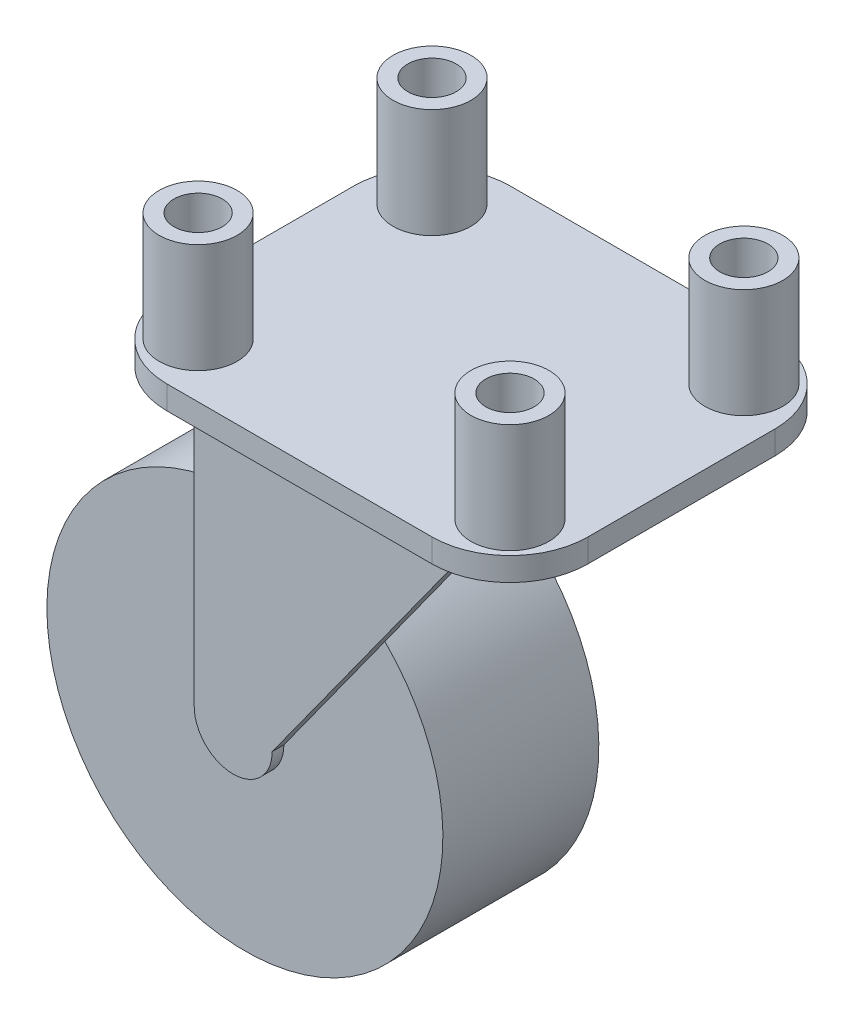
ISO-10303-21;
HEADER;
FILE_DESCRIPTION(('STEP AP214'),'2;1');
FILE_NAME('part.step','',(''),(''),'','','');
FILE_SCHEMA(('AUTOMOTIVE_DESIGN { 1 0 10303 214 1 1 1 1 }'));
ENDSEC;
DATA;
#1=APPLICATION_CONTEXT('core data for automotive mechanical design processes');
#2=APPLICATION_PROTOCOL_DEFINITION('international standard','automotive_design',2000,#1);
#3=PRODUCT_CONTEXT('',#1,'mechanical');
#4=PRODUCT('Part','Part','',(#3));
#5=PRODUCT_RELATED_PRODUCT_CATEGORY('part','',(#4));
#6=PRODUCT_DEFINITION_FORMATION('','',#4);
#7=PRODUCT_DEFINITION_CONTEXT('part definition',#1,'design');
#8=PRODUCT_DEFINITION('design','',#6,#7);
#9=PRODUCT_DEFINITION_SHAPE('','',#8);
#10=(LENGTH_UNIT() NAMED_UNIT(*) SI_UNIT(.MILLI.,.METRE.));
#11=(NAMED_UNIT(*) PLANE_ANGLE_UNIT() SI_UNIT($,.RADIAN.));
#12=(NAMED_UNIT(*) SI_UNIT($,.STERADIAN.) SOLID_ANGLE_UNIT());
#13=UNCERTAINTY_MEASURE_WITH_UNIT(LENGTH_MEASURE(1.E-05),#10,'distance_accuracy_value','');
#14=(GEOMETRIC_REPRESENTATION_CONTEXT(3) GLOBAL_UNCERTAINTY_ASSIGNED_CONTEXT((#13)) GLOBAL_UNIT_ASSIGNED_CONTEXT((#10,
#11,#12)) REPRESENTATION_CONTEXT('',''));
#15=CARTESIAN_POINT('',(0.,0.,0.));
#16=DIRECTION('',(0.,0.,1.));
#17=DIRECTION('',(1.,0.,0.));
#18=AXIS2_PLACEMENT_3D('',#15,#16,#17);
#19=CARTESIAN_POINT('',(0.,44.6,0.));
#20=DIRECTION('',(0.,1.,0.));
#21=DIRECTION('',(0.,0.,1.));
#22=AXIS2_PLACEMENT_3D('',#19,#20,#21);
#23=PLANE('',#22);
#24=CARTESIAN_POINT('',(-1.,44.6,15.));
#25=DIRECTION('',(0.,1.,0.));
#26=DIRECTION('',(0.,0.,1.));
#27=AXIS2_PLACEMENT_3D('',#24,#25,#26);
#28=CIRCLE('',#27,5.);
#29=CARTESIAN_POINT('',(-1.,44.6,20.));
#30=VERTEX_POINT('',#29);
#31=EDGE_CURVE('E700',#30,#30,#28,.T.);
#32=ORIENTED_EDGE('',*,*,#31,.F.);
#33=EDGE_LOOP('',(#32));
#34=FACE_BOUND('',#33,.T.);
#35=CARTESIAN_POINT('',(-1.,44.6,-15.));
#36=DIRECTION('',(0.,1.,0.));
#37=DIRECTION('',(0.,0.,1.));
#38=AXIS2_PLACEMENT_3D('',#35,#36,#37);
#39=CIRCLE('',#38,5.);
#40=CARTESIAN_POINT('',(-1.,44.6,-10.));
#41=VERTEX_POINT('',#40);
#42=EDGE_CURVE('E718',#41,#41,#39,.T.);
#43=ORIENTED_EDGE('',*,*,#42,.F.);
#44=EDGE_LOOP('',(#43));
#45=FACE_BOUND('',#44,.T.);
#46=DIRECTION('',(0.,0.,-1.));
#47=VECTOR('',#46,1.);
#48=CARTESIAN_POINT('',(46.,44.6,-22.));
#49=LINE('',#48,#47);
#50=CARTESIAN_POINT('',(46.,44.6,12.));
#51=VERTEX_POINT('',#50);
#52=CARTESIAN_POINT('',(46.,44.6,-12.));
#53=VERTEX_POINT('',#52);
#54=EDGE_CURVE('E734',#51,#53,#49,.T.);
#55=ORIENTED_EDGE('',*,*,#54,.T.);
#56=CARTESIAN_POINT('',(36.,44.6,-12.));
#57=DIRECTION('',(0.,1.,0.));
#58=DIRECTION('',(0.,0.,1.));
#59=AXIS2_PLACEMENT_3D('',#56,#57,#58);
#60=CIRCLE('',#59,10.);
#61=CARTESIAN_POINT('',(36.,44.6,-22.));
#62=VERTEX_POINT('',#61);
#63=EDGE_CURVE('E265',#53,#62,#60,.T.);
#64=ORIENTED_EDGE('',*,*,#63,.T.);
#65=DIRECTION('',(-1.,0.,0.));
#66=VECTOR('',#65,1.);
#67=CARTESIAN_POINT('',(-8.,44.6,-22.));
#68=LINE('',#67,#66);
#69=CARTESIAN_POINT('',(2.,44.6,-22.));
#70=VERTEX_POINT('',#69);
#71=EDGE_CURVE('E295',#62,#70,#68,.T.);
#72=ORIENTED_EDGE('',*,*,#71,.T.);
#73=CARTESIAN_POINT('',(2.,44.6,-12.));
#74=DIRECTION('',(0.,1.,0.));
#75=DIRECTION('',(0.,0.,1.));
#76=AXIS2_PLACEMENT_3D('',#73,#74,#75);
#77=CIRCLE('',#76,10.);
#78=CARTESIAN_POINT('',(-8.,44.6,-12.));
#79=VERTEX_POINT('',#78);
#80=EDGE_CURVE('E260',#70,#79,#77,.T.);
#81=ORIENTED_EDGE('',*,*,#80,.T.);
#82=DIRECTION('',(0.,0.,1.));
#83=VECTOR('',#82,1.);
#84=CARTESIAN_POINT('',(-8.,44.6,-22.));
#85=LINE('',#84,#83);
#86=CARTESIAN_POINT('',(-8.,44.6,12.));
#87=VERTEX_POINT('',#86);
#88=EDGE_CURVE('E279',#79,#87,#85,.T.);
#89=ORIENTED_EDGE('',*,*,#88,.T.);
#90=CARTESIAN_POINT('',(2.,44.6,12.));
#91=DIRECTION('',(0.,1.,0.));
#92=DIRECTION('',(0.,0.,1.));
#93=AXIS2_PLACEMENT_3D('',#90,#91,#92);
#94=CIRCLE('',#93,10.);
#95=CARTESIAN_POINT('',(2.,44.6,22.));
#96=VERTEX_POINT('',#95);
#97=EDGE_CURVE('E61',#87,#96,#94,.T.);
#98=ORIENTED_EDGE('',*,*,#97,.T.);
#99=DIRECTION('',(1.,0.,0.));
#100=VECTOR('',#99,1.);
#101=CARTESIAN_POINT('',(-8.,44.6,22.));
#102=LINE('',#101,#100);
#103=CARTESIAN_POINT('',(36.,44.6,22.));
#104=VERTEX_POINT('',#103);
#105=EDGE_CURVE('E733',#96,#104,#102,.T.);
#106=ORIENTED_EDGE('',*,*,#105,.T.);
#107=CARTESIAN_POINT('',(36.,44.6,12.));
#108=DIRECTION('',(0.,1.,0.));
#109=DIRECTION('',(0.,0.,1.));
#110=AXIS2_PLACEMENT_3D('',#107,#108,#109);
#111=CIRCLE('',#110,10.);
#112=EDGE_CURVE('E263',#104,#51,#111,.T.);
#113=ORIENTED_EDGE('',*,*,#112,.T.);
#114=EDGE_LOOP('',(#55,#64,#72,#81,#89,#98,#106,#113));
#115=FACE_BOUND('',#114,.T.);
#116=CARTESIAN_POINT('',(39.,44.6,-15.));
#117=DIRECTION('',(0.,1.,0.));
#118=DIRECTION('',(0.,0.,1.));
#119=AXIS2_PLACEMENT_3D('',#116,#117,#118);
#120=CIRCLE('',#119,5.);
#121=CARTESIAN_POINT('',(39.,44.6,-10.));
#122=VERTEX_POINT('',#121);
#123=EDGE_CURVE('E709',#122,#122,#120,.T.);
#124=ORIENTED_EDGE('',*,*,#123,.F.);
#125=EDGE_LOOP('',(#124));
#126=FACE_BOUND('',#125,.T.);
#127=CARTESIAN_POINT('',(39.,44.6,15.));
#128=DIRECTION('',(0.,1.,0.));
#129=DIRECTION('',(0.,0.,1.));
#130=AXIS2_PLACEMENT_3D('',#127,#128,#129);
#131=CIRCLE('',#130,5.);
#132=CARTESIAN_POINT('',(39.,44.6,20.));
#133=VERTEX_POINT('',#132);
#134=EDGE_CURVE('E689',#133,#133,#131,.T.);
#135=ORIENTED_EDGE('',*,*,#134,.F.);
#136=EDGE_LOOP('',(#135));
#137=FACE_BOUND('',#136,.T.);
#138=ADVANCED_FACE('F39',(#34,#45,#115,#126,#137),#23,.T.);
#139=CARTESIAN_POINT('',(0.,0.,-10.));
#140=DIRECTION('',(0.,0.,1.));
#141=DIRECTION('',(1.,0.,0.));
#142=AXIS2_PLACEMENT_3D('',#139,#140,#141);
#143=CYLINDRICAL_SURFACE('',#142,25.4);
#144=CARTESIAN_POINT('',(0.,0.,-10.));
#145=DIRECTION('',(0.,0.,1.));
#146=DIRECTION('',(1.,0.,0.));
#147=AXIS2_PLACEMENT_3D('',#144,#145,#146);
#148=CIRCLE('',#147,25.4);
#149=CARTESIAN_POINT('',(17.9557359837117,17.9652872307469,-10.));
#150=VERTEX_POINT('',#149);
#151=CARTESIAN_POINT('',(-5.,24.9030118660374,-10.));
#152=VERTEX_POINT('',#151);
#153=EDGE_CURVE('E182',#150,#152,#148,.T.);
#154=ORIENTED_EDGE('',*,*,#153,.T.);
#155=EDGE_CURVE('E239',#152,#150,#148,.T.);
#156=ORIENTED_EDGE('',*,*,#155,.T.);
#157=EDGE_LOOP('',(#154,#156));
#158=FACE_BOUND('',#157,.T.);
#159=CARTESIAN_POINT('',(0.,0.,10.));
#160=DIRECTION('',(0.,0.,1.));
#161=DIRECTION('',(1.,0.,0.));
#162=AXIS2_PLACEMENT_3D('',#159,#160,#161);
#163=CIRCLE('',#162,25.4);
#164=CARTESIAN_POINT('',(17.9557359837117,17.9652872307469,10.));
#165=VERTEX_POINT('',#164);
#166=CARTESIAN_POINT('',(-5.,24.9030118660374,10.));
#167=VERTEX_POINT('',#166);
#168=EDGE_CURVE('E236',#165,#167,#163,.T.);
#169=ORIENTED_EDGE('',*,*,#168,.F.);
#170=EDGE_CURVE('E235',#167,#165,#163,.T.);
#171=ORIENTED_EDGE('',*,*,#170,.F.);
#172=EDGE_LOOP('',(#169,#171));
#173=FACE_BOUND('',#172,.T.);
#174=ADVANCED_FACE('F320',(#158,#173),#143,.T.);
#175=CARTESIAN_POINT('',(0.,0.,-10.));
#176=DIRECTION('',(0.,0.,1.));
#177=DIRECTION('',(1.,0.,0.));
#178=AXIS2_PLACEMENT_3D('',#175,#176,#177);
#179=PLANE('',#178);
#180=CARTESIAN_POINT('',(0.,0.,-10.));
#181=DIRECTION('',(0.,0.,1.));
#182=DIRECTION('',(1.,0.,0.));
#183=AXIS2_PLACEMENT_3D('',#180,#181,#182);
#184=CIRCLE('',#183,5.);
#185=CARTESIAN_POINT('',(-5.,0.,-10.));
#186=VERTEX_POINT('',#185);
#187=CARTESIAN_POINT('',(5.,0.,-10.));
#188=VERTEX_POINT('',#187);
#189=EDGE_CURVE('E311',#186,#188,#184,.T.);
#190=ORIENTED_EDGE('',*,*,#189,.T.);
#191=DIRECTION('',(0.584920912340988,0.811090331779504,0.));
#192=VECTOR('',#191,1.);
#193=CARTESIAN_POINT('',(35.,41.6,-10.));
#194=LINE('',#193,#192);
#195=EDGE_CURVE('E186',#188,#150,#194,.T.);
#196=ORIENTED_EDGE('',*,*,#195,.T.);
#197=ORIENTED_EDGE('',*,*,#155,.F.);
#198=DIRECTION('',(0.,-1.,0.));
#199=VECTOR('',#198,1.);
#200=CARTESIAN_POINT('',(-5.,0.,-10.));
#201=LINE('',#200,#199);
#202=EDGE_CURVE('E244',#152,#186,#201,.T.);
#203=ORIENTED_EDGE('',*,*,#202,.T.);
#204=EDGE_LOOP('',(#190,#196,#197,#203));
#205=FACE_BOUND('',#204,.T.);
#206=ADVANCED_FACE('F317',(#205),#179,.F.);
#207=CARTESIAN_POINT('',(0.,0.,10.));
#208=DIRECTION('',(0.,0.,1.));
#209=DIRECTION('',(1.,0.,0.));
#210=AXIS2_PLACEMENT_3D('',#207,#208,#209);
#211=PLANE('',#210);
#212=DIRECTION('',(0.,-1.,0.));
#213=VECTOR('',#212,1.);
#214=CARTESIAN_POINT('',(-5.,0.,10.));
#215=LINE('',#214,#213);
#216=CARTESIAN_POINT('',(-5.,0.,10.));
#217=VERTEX_POINT('',#216);
#218=EDGE_CURVE('E224',#167,#217,#215,.T.);
#219=ORIENTED_EDGE('',*,*,#218,.F.);
#220=ORIENTED_EDGE('',*,*,#170,.T.);
#221=DIRECTION('',(0.584920912340988,0.811090331779504,0.));
#222=VECTOR('',#221,1.);
#223=CARTESIAN_POINT('',(35.,41.6,10.));
#224=LINE('',#223,#222);
#225=CARTESIAN_POINT('',(5.,0.,10.));
#226=VERTEX_POINT('',#225);
#227=EDGE_CURVE('E217',#226,#165,#224,.T.);
#228=ORIENTED_EDGE('',*,*,#227,.F.);
#229=CARTESIAN_POINT('',(0.,0.,10.));
#230=DIRECTION('',(0.,0.,1.));
#231=DIRECTION('',(1.,0.,0.));
#232=AXIS2_PLACEMENT_3D('',#229,#230,#231);
#233=CIRCLE('',#232,5.);
#234=EDGE_CURVE('E200',#217,#226,#233,.T.);
#235=ORIENTED_EDGE('',*,*,#234,.F.);
#236=EDGE_LOOP('',(#219,#220,#228,#235));
#237=FACE_BOUND('',#236,.T.);
#238=ADVANCED_FACE('F330',(#237),#211,.T.);
#239=CARTESIAN_POINT('',(0.,0.,10.));
#240=DIRECTION('',(0.,0.,1.));
#241=DIRECTION('',(1.,0.,0.));
#242=AXIS2_PLACEMENT_3D('',#239,#240,#241);
#243=PLANE('',#242);
#244=CARTESIAN_POINT('',(35.,41.6,10.));
#245=VERTEX_POINT('',#244);
#246=EDGE_CURVE('E216',#165,#245,#224,.T.);
#247=ORIENTED_EDGE('',*,*,#246,.F.);
#248=ORIENTED_EDGE('',*,*,#168,.T.);
#249=CARTESIAN_POINT('',(-5.,41.6,10.));
#250=VERTEX_POINT('',#249);
#251=EDGE_CURVE('E205',#250,#167,#215,.T.);
#252=ORIENTED_EDGE('',*,*,#251,.F.);
#253=DIRECTION('',(-1.,0.,0.));
#254=VECTOR('',#253,1.);
#255=CARTESIAN_POINT('',(-5.,41.6,10.));
#256=LINE('',#255,#254);
#257=EDGE_CURVE('E220',#245,#250,#256,.T.);
#258=ORIENTED_EDGE('',*,*,#257,.F.);
#259=EDGE_LOOP('',(#247,#248,#252,#258));
#260=FACE_BOUND('',#259,.T.);
#261=ADVANCED_FACE('F334',(#260),#243,.F.);
#262=CARTESIAN_POINT('',(0.,0.,11.5));
#263=DIRECTION('',(0.,0.,-1.));
#264=DIRECTION('',(-1.,0.,0.));
#265=AXIS2_PLACEMENT_3D('',#262,#263,#264);
#266=CYLINDRICAL_SURFACE('',#265,5.);
#267=ORIENTED_EDGE('',*,*,#234,.T.);
#268=DIRECTION('',(0.,0.,-1.));
#269=VECTOR('',#268,1.);
#270=CARTESIAN_POINT('',(5.,0.,11.5));
#271=LINE('',#270,#269);
#272=CARTESIAN_POINT('',(5.,0.,11.5));
#273=VERTEX_POINT('',#272);
#274=EDGE_CURVE('E232',#273,#226,#271,.T.);
#275=ORIENTED_EDGE('',*,*,#274,.F.);
#276=CARTESIAN_POINT('',(0.,0.,11.5));
#277=DIRECTION('',(0.,0.,1.));
#278=DIRECTION('',(1.,0.,0.));
#279=AXIS2_PLACEMENT_3D('',#276,#277,#278);
#280=CIRCLE('',#279,5.);
#281=CARTESIAN_POINT('',(-5.,0.,11.5));
#282=VERTEX_POINT('',#281);
#283=EDGE_CURVE('E201',#282,#273,#280,.T.);
#284=ORIENTED_EDGE('',*,*,#283,.F.);
#285=DIRECTION('',(0.,0.,-1.));
#286=VECTOR('',#285,1.);
#287=CARTESIAN_POINT('',(-5.,0.,11.5));
#288=LINE('',#287,#286);
#289=EDGE_CURVE('E213',#282,#217,#288,.T.);
#290=ORIENTED_EDGE('',*,*,#289,.T.);
#291=EDGE_LOOP('',(#267,#275,#284,#290));
#292=FACE_BOUND('',#291,.T.);
#293=ADVANCED_FACE('F341',(#292),#266,.T.);
#294=CARTESIAN_POINT('',(35.,41.6,11.5));
#295=DIRECTION('',(-0.811090331779504,0.584920912340988,0.));
#296=DIRECTION('',(-0.584920912340988,-0.811090331779504,0.));
#297=AXIS2_PLACEMENT_3D('',#294,#295,#296);
#298=PLANE('',#297);
#299=ORIENTED_EDGE('',*,*,#227,.T.);
#300=ORIENTED_EDGE('',*,*,#246,.T.);
#301=DIRECTION('',(0.,0.,-1.));
#302=VECTOR('',#301,1.);
#303=CARTESIAN_POINT('',(35.,41.6,11.5));
#304=LINE('',#303,#302);
#305=CARTESIAN_POINT('',(35.,41.6,11.5));
#306=VERTEX_POINT('',#305);
#307=EDGE_CURVE('E230',#306,#245,#304,.T.);
#308=ORIENTED_EDGE('',*,*,#307,.F.);
#309=DIRECTION('',(0.584920912340988,0.811090331779504,0.));
#310=VECTOR('',#309,1.);
#311=CARTESIAN_POINT('',(35.,41.6,11.5));
#312=LINE('',#311,#310);
#313=EDGE_CURVE('E204',#273,#306,#312,.T.);
#314=ORIENTED_EDGE('',*,*,#313,.F.);
#315=ORIENTED_EDGE('',*,*,#274,.T.);
#316=EDGE_LOOP('',(#299,#300,#308,#314,#315));
#317=FACE_BOUND('',#316,.T.);
#318=ADVANCED_FACE('F337',(#317),#298,.F.);
#319=CARTESIAN_POINT('',(-5.,0.,11.5));
#320=DIRECTION('',(1.,0.,0.));
#321=DIRECTION('',(0.,0.,-1.));
#322=AXIS2_PLACEMENT_3D('',#319,#320,#321);
#323=PLANE('',#322);
#324=ORIENTED_EDGE('',*,*,#251,.T.);
#325=ORIENTED_EDGE('',*,*,#218,.T.);
#326=ORIENTED_EDGE('',*,*,#289,.F.);
#327=DIRECTION('',(0.,-1.,0.));
#328=VECTOR('',#327,1.);
#329=CARTESIAN_POINT('',(-5.,0.,11.5));
#330=LINE('',#329,#328);
#331=CARTESIAN_POINT('',(-5.,41.6,11.5));
#332=VERTEX_POINT('',#331);
#333=EDGE_CURVE('E211',#332,#282,#330,.T.);
#334=ORIENTED_EDGE('',*,*,#333,.F.);
#335=DIRECTION('',(0.,0.,-1.));
#336=VECTOR('',#335,1.);
#337=CARTESIAN_POINT('',(-5.,41.6,11.5));
#338=LINE('',#337,#336);
#339=EDGE_CURVE('E227',#332,#250,#338,.T.);
#340=ORIENTED_EDGE('',*,*,#339,.T.);
#341=EDGE_LOOP('',(#324,#325,#326,#334,#340));
#342=FACE_BOUND('',#341,.T.);
#343=ADVANCED_FACE('F344',(#342),#323,.F.);
#344=CARTESIAN_POINT('',(0.,0.,11.5));
#345=DIRECTION('',(0.,0.,1.));
#346=DIRECTION('',(1.,0.,0.));
#347=AXIS2_PLACEMENT_3D('',#344,#345,#346);
#348=PLANE('',#347);
#349=ORIENTED_EDGE('',*,*,#283,.T.);
#350=ORIENTED_EDGE('',*,*,#313,.T.);
#351=DIRECTION('',(-1.,0.,0.));
#352=VECTOR('',#351,1.);
#353=CARTESIAN_POINT('',(-5.,41.6,11.5));
#354=LINE('',#353,#352);
#355=EDGE_CURVE('E208',#306,#332,#354,.T.);
#356=ORIENTED_EDGE('',*,*,#355,.T.);
#357=ORIENTED_EDGE('',*,*,#333,.T.);
#358=EDGE_LOOP('',(#349,#350,#356,#357));
#359=FACE_BOUND('',#358,.T.);
#360=ADVANCED_FACE('F615',(#359),#348,.T.);
#361=CARTESIAN_POINT('',(0.,0.,-11.5));
#362=DIRECTION('',(0.,0.,1.));
#363=DIRECTION('',(1.,0.,0.));
#364=AXIS2_PLACEMENT_3D('',#361,#362,#363);
#365=CYLINDRICAL_SURFACE('',#364,5.);
#366=ORIENTED_EDGE('',*,*,#189,.F.);
#367=DIRECTION('',(0.,0.,1.));
#368=VECTOR('',#367,1.);
#369=CARTESIAN_POINT('',(-5.,0.,-11.5));
#370=LINE('',#369,#368);
#371=CARTESIAN_POINT('',(-5.,0.,-11.5));
#372=VERTEX_POINT('',#371);
#373=EDGE_CURVE('E194',#372,#186,#370,.T.);
#374=ORIENTED_EDGE('',*,*,#373,.F.);
#375=CARTESIAN_POINT('',(0.,0.,-11.5));
#376=DIRECTION('',(0.,0.,1.));
#377=DIRECTION('',(1.,0.,0.));
#378=AXIS2_PLACEMENT_3D('',#375,#376,#377);
#379=CIRCLE('',#378,5.);
#380=CARTESIAN_POINT('',(5.,0.,-11.5));
#381=VERTEX_POINT('',#380);
#382=EDGE_CURVE('E302',#372,#381,#379,.T.);
#383=ORIENTED_EDGE('',*,*,#382,.T.);
#384=DIRECTION('',(0.,0.,1.));
#385=VECTOR('',#384,1.);
#386=CARTESIAN_POINT('',(5.,0.,-11.5));
#387=LINE('',#386,#385);
#388=EDGE_CURVE('E192',#381,#188,#387,.T.);
#389=ORIENTED_EDGE('',*,*,#388,.T.);
#390=EDGE_LOOP('',(#366,#374,#383,#389));
#391=FACE_BOUND('',#390,.T.);
#392=ADVANCED_FACE('F351',(#391),#365,.T.);
#393=CARTESIAN_POINT('',(-5.,0.,-11.5));
#394=DIRECTION('',(-1.,0.,0.));
#395=DIRECTION('',(0.,0.,1.));
#396=AXIS2_PLACEMENT_3D('',#393,#394,#395);
#397=PLANE('',#396);
#398=CARTESIAN_POINT('',(-5.,41.6,-10.));
#399=VERTEX_POINT('',#398);
#400=EDGE_CURVE('E177',#399,#152,#201,.T.);
#401=ORIENTED_EDGE('',*,*,#400,.F.);
#402=DIRECTION('',(0.,0.,1.));
#403=VECTOR('',#402,1.);
#404=CARTESIAN_POINT('',(-5.,41.6,-11.5));
#405=LINE('',#404,#403);
#406=CARTESIAN_POINT('',(-5.,41.6,-11.5));
#407=VERTEX_POINT('',#406);
#408=EDGE_CURVE('E172',#407,#399,#405,.T.);
#409=ORIENTED_EDGE('',*,*,#408,.F.);
#410=DIRECTION('',(0.,-1.,0.));
#411=VECTOR('',#410,1.);
#412=CARTESIAN_POINT('',(-5.,0.,-11.5));
#413=LINE('',#412,#411);
#414=EDGE_CURVE('E305',#407,#372,#413,.T.);
#415=ORIENTED_EDGE('',*,*,#414,.T.);
#416=ORIENTED_EDGE('',*,*,#373,.T.);
#417=ORIENTED_EDGE('',*,*,#202,.F.);
#418=EDGE_LOOP('',(#401,#409,#415,#416,#417));
#419=FACE_BOUND('',#418,.T.);
#420=ADVANCED_FACE('F347',(#419),#397,.T.);
#421=CARTESIAN_POINT('',(35.,41.6,-11.5));
#422=DIRECTION('',(0.811090331779504,-0.584920912340988,0.));
#423=DIRECTION('',(0.584920912340988,0.811090331779504,0.));
#424=AXIS2_PLACEMENT_3D('',#421,#422,#423);
#425=PLANE('',#424);
#426=ORIENTED_EDGE('',*,*,#195,.F.);
#427=ORIENTED_EDGE('',*,*,#388,.F.);
#428=DIRECTION('',(0.584920912340988,0.811090331779504,0.));
#429=VECTOR('',#428,1.);
#430=CARTESIAN_POINT('',(35.,41.6,-11.5));
#431=LINE('',#430,#429);
#432=CARTESIAN_POINT('',(35.,41.6,-11.5));
#433=VERTEX_POINT('',#432);
#434=EDGE_CURVE('E191',#381,#433,#431,.T.);
#435=ORIENTED_EDGE('',*,*,#434,.T.);
#436=DIRECTION('',(0.,0.,1.));
#437=VECTOR('',#436,1.);
#438=CARTESIAN_POINT('',(35.,41.6,-11.5));
#439=LINE('',#438,#437);
#440=CARTESIAN_POINT('',(35.,41.6,-10.));
#441=VERTEX_POINT('',#440);
#442=EDGE_CURVE('E169',#433,#441,#439,.T.);
#443=ORIENTED_EDGE('',*,*,#442,.T.);
#444=EDGE_CURVE('E176',#150,#441,#194,.T.);
#445=ORIENTED_EDGE('',*,*,#444,.F.);
#446=EDGE_LOOP('',(#426,#427,#435,#443,#445));
#447=FACE_BOUND('',#446,.T.);
#448=ADVANCED_FACE('F189',(#447),#425,.T.);
#449=CARTESIAN_POINT('',(0.,0.,-11.5));
#450=DIRECTION('',(0.,0.,-1.));
#451=DIRECTION('',(1.,0.,0.));
#452=AXIS2_PLACEMENT_3D('',#449,#450,#451);
#453=PLANE('',#452);
#454=ORIENTED_EDGE('',*,*,#382,.F.);
#455=ORIENTED_EDGE('',*,*,#414,.F.);
#456=DIRECTION('',(-1.,0.,0.));
#457=VECTOR('',#456,1.);
#458=CARTESIAN_POINT('',(-5.,41.6,-11.5));
#459=LINE('',#458,#457);
#460=EDGE_CURVE('E308',#433,#407,#459,.T.);
#461=ORIENTED_EDGE('',*,*,#460,.F.);
#462=ORIENTED_EDGE('',*,*,#434,.F.);
#463=EDGE_LOOP('',(#454,#455,#461,#462));
#464=FACE_BOUND('',#463,.T.);
#465=ADVANCED_FACE('F353',(#464),#453,.T.);
#466=CARTESIAN_POINT('',(0.,0.,-10.));
#467=DIRECTION('',(0.,0.,-1.));
#468=DIRECTION('',(1.,0.,0.));
#469=AXIS2_PLACEMENT_3D('',#466,#467,#468);
#470=PLANE('',#469);
#471=ORIENTED_EDGE('',*,*,#153,.F.);
#472=ORIENTED_EDGE('',*,*,#444,.T.);
#473=DIRECTION('',(-1.,0.,0.));
#474=VECTOR('',#473,1.);
#475=CARTESIAN_POINT('',(-5.,41.6,-10.));
#476=LINE('',#475,#474);
#477=EDGE_CURVE('E164',#441,#399,#476,.T.);
#478=ORIENTED_EDGE('',*,*,#477,.T.);
#479=ORIENTED_EDGE('',*,*,#400,.T.);
#480=EDGE_LOOP('',(#471,#472,#478,#479));
#481=FACE_BOUND('',#480,.T.);
#482=ADVANCED_FACE('F180',(#481),#470,.F.);
#483=CARTESIAN_POINT('',(0.,41.6,0.));
#484=DIRECTION('',(0.,1.,0.));
#485=DIRECTION('',(0.,0.,1.));
#486=AXIS2_PLACEMENT_3D('',#483,#484,#485);
#487=PLANE('',#486);
#488=CARTESIAN_POINT('',(-1.,41.6,15.));
#489=DIRECTION('',(0.,1.,0.));
#490=DIRECTION('',(0.,0.,1.));
#491=AXIS2_PLACEMENT_3D('',#488,#489,#490);
#492=CIRCLE('',#491,3.1);
#493=CARTESIAN_POINT('',(-1.,41.6,18.1));
#494=VERTEX_POINT('',#493);
#495=EDGE_CURVE('E722',#494,#494,#492,.F.);
#496=ORIENTED_EDGE('',*,*,#495,.F.);
#497=EDGE_LOOP('',(#496));
#498=FACE_BOUND('',#497,.T.);
#499=CARTESIAN_POINT('',(39.,41.6,15.));
#500=DIRECTION('',(0.,1.,0.));
#501=DIRECTION('',(0.,0.,1.));
#502=AXIS2_PLACEMENT_3D('',#499,#500,#501);
#503=CIRCLE('',#502,3.09999999999999);
#504=CARTESIAN_POINT('',(39.,41.6,18.1));
#505=VERTEX_POINT('',#504);
#506=EDGE_CURVE('E727',#505,#505,#503,.F.);
#507=ORIENTED_EDGE('',*,*,#506,.F.);
#508=EDGE_LOOP('',(#507));
#509=FACE_BOUND('',#508,.T.);
#510=CARTESIAN_POINT('',(39.,41.6,-15.));
#511=DIRECTION('',(0.,1.,0.));
#512=DIRECTION('',(0.,0.,1.));
#513=AXIS2_PLACEMENT_3D('',#510,#511,#512);
#514=CIRCLE('',#513,3.09999999999999);
#515=CARTESIAN_POINT('',(39.,41.6,-11.9));
#516=VERTEX_POINT('',#515);
#517=EDGE_CURVE('E292',#516,#516,#514,.F.);
#518=ORIENTED_EDGE('',*,*,#517,.F.);
#519=EDGE_LOOP('',(#518));
#520=FACE_BOUND('',#519,.T.);
#521=CARTESIAN_POINT('',(-1.,41.6,-15.));
#522=DIRECTION('',(0.,1.,0.));
#523=DIRECTION('',(0.,0.,1.));
#524=AXIS2_PLACEMENT_3D('',#521,#522,#523);
#525=CIRCLE('',#524,3.1);
#526=CARTESIAN_POINT('',(-1.,41.6,-11.9));
#527=VERTEX_POINT('',#526);
#528=EDGE_CURVE('E287',#527,#527,#525,.F.);
#529=ORIENTED_EDGE('',*,*,#528,.F.);
#530=EDGE_LOOP('',(#529));
#531=FACE_BOUND('',#530,.T.);
#532=ORIENTED_EDGE('',*,*,#460,.T.);
#533=ORIENTED_EDGE('',*,*,#408,.T.);
#534=ORIENTED_EDGE('',*,*,#477,.F.);
#535=ORIENTED_EDGE('',*,*,#442,.F.);
#536=EDGE_LOOP('',(#532,#533,#534,#535));
#537=FACE_BOUND('',#536,.T.);
#538=DIRECTION('',(-1.,0.,0.));
#539=VECTOR('',#538,1.);
#540=CARTESIAN_POINT('',(-8.,41.6,-22.));
#541=LINE('',#540,#539);
#542=CARTESIAN_POINT('',(36.,41.6,-22.));
#543=VERTEX_POINT('',#542);
#544=CARTESIAN_POINT('',(2.,41.6,-22.));
#545=VERTEX_POINT('',#544);
#546=EDGE_CURVE('E300',#543,#545,#541,.T.);
#547=ORIENTED_EDGE('',*,*,#546,.F.);
#548=CARTESIAN_POINT('',(36.,41.6,-12.));
#549=DIRECTION('',(0.,1.,0.));
#550=DIRECTION('',(0.,0.,1.));
#551=AXIS2_PLACEMENT_3D('',#548,#549,#550);
#552=CIRCLE('',#551,10.);
#553=CARTESIAN_POINT('',(46.,41.6,-12.));
#554=VERTEX_POINT('',#553);
#555=EDGE_CURVE('E253',#543,#554,#552,.F.);
#556=ORIENTED_EDGE('',*,*,#555,.T.);
#557=DIRECTION('',(0.,0.,-1.));
#558=VECTOR('',#557,1.);
#559=CARTESIAN_POINT('',(46.,41.6,-22.));
#560=LINE('',#559,#558);
#561=CARTESIAN_POINT('',(46.,41.6,12.));
#562=VERTEX_POINT('',#561);
#563=EDGE_CURVE('E289',#562,#554,#560,.T.);
#564=ORIENTED_EDGE('',*,*,#563,.F.);
#565=CARTESIAN_POINT('',(36.,41.6,12.));
#566=DIRECTION('',(0.,1.,0.));
#567=DIRECTION('',(0.,0.,1.));
#568=AXIS2_PLACEMENT_3D('',#565,#566,#567);
#569=CIRCLE('',#568,10.);
#570=CARTESIAN_POINT('',(36.,41.6,22.));
#571=VERTEX_POINT('',#570);
#572=EDGE_CURVE('E251',#562,#571,#569,.F.);
#573=ORIENTED_EDGE('',*,*,#572,.T.);
#574=DIRECTION('',(1.,0.,0.));
#575=VECTOR('',#574,1.);
#576=CARTESIAN_POINT('',(-8.,41.6,22.));
#577=LINE('',#576,#575);
#578=CARTESIAN_POINT('',(2.,41.6,22.));
#579=VERTEX_POINT('',#578);
#580=EDGE_CURVE('E286',#579,#571,#577,.T.);
#581=ORIENTED_EDGE('',*,*,#580,.F.);
#582=CARTESIAN_POINT('',(2.,41.6,12.));
#583=DIRECTION('',(0.,1.,0.));
#584=DIRECTION('',(0.,0.,1.));
#585=AXIS2_PLACEMENT_3D('',#582,#583,#584);
#586=CIRCLE('',#585,10.);
#587=CARTESIAN_POINT('',(-8.,41.6,12.));
#588=VERTEX_POINT('',#587);
#589=EDGE_CURVE('E249',#579,#588,#586,.F.);
#590=ORIENTED_EDGE('',*,*,#589,.T.);
#591=DIRECTION('',(0.,0.,1.));
#592=VECTOR('',#591,1.);
#593=CARTESIAN_POINT('',(-8.,41.6,-22.));
#594=LINE('',#593,#592);
#595=CARTESIAN_POINT('',(-8.,41.6,-12.));
#596=VERTEX_POINT('',#595);
#597=EDGE_CURVE('E277',#596,#588,#594,.T.);
#598=ORIENTED_EDGE('',*,*,#597,.F.);
#599=CARTESIAN_POINT('',(2.,41.6,-12.));
#600=DIRECTION('',(0.,1.,0.));
#601=DIRECTION('',(0.,0.,1.));
#602=AXIS2_PLACEMENT_3D('',#599,#600,#601);
#603=CIRCLE('',#602,10.);
#604=EDGE_CURVE('E247',#596,#545,#603,.F.);
#605=ORIENTED_EDGE('',*,*,#604,.T.);
#606=EDGE_LOOP('',(#547,#556,#564,#573,#581,#590,#598,#605));
#607=FACE_BOUND('',#606,.T.);
#608=ORIENTED_EDGE('',*,*,#307,.T.);
#609=ORIENTED_EDGE('',*,*,#257,.T.);
#610=ORIENTED_EDGE('',*,*,#339,.F.);
#611=ORIENTED_EDGE('',*,*,#355,.F.);
#612=EDGE_LOOP('',(#608,#609,#610,#611));
#613=FACE_BOUND('',#612,.T.);
#614=ADVANCED_FACE('F166',(#498,#509,#520,#531,#537,#607,#613),#487,.F.);
#615=CARTESIAN_POINT('',(-8.,44.6,-22.));
#616=DIRECTION('',(1.,0.,0.));
#617=DIRECTION('',(0.,0.,-1.));
#618=AXIS2_PLACEMENT_3D('',#615,#616,#617);
#619=PLANE('',#618);
#620=ORIENTED_EDGE('',*,*,#597,.T.);
#621=DIRECTION('',(0.,-1.,0.));
#622=VECTOR('',#621,1.);
#623=CARTESIAN_POINT('',(-8.,44.6,12.));
#624=LINE('',#623,#622);
#625=EDGE_CURVE('E11',#588,#87,#624,.F.);
#626=ORIENTED_EDGE('',*,*,#625,.T.);
#627=ORIENTED_EDGE('',*,*,#88,.F.);
#628=DIRECTION('',(0.,-1.,0.));
#629=VECTOR('',#628,1.);
#630=CARTESIAN_POINT('',(-8.,44.6,-12.));
#631=LINE('',#630,#629);
#632=EDGE_CURVE('E47',#79,#596,#631,.T.);
#633=ORIENTED_EDGE('',*,*,#632,.T.);
#634=EDGE_LOOP('',(#620,#626,#627,#633));
#635=FACE_BOUND('',#634,.T.);
#636=ADVANCED_FACE('F276',(#635),#619,.F.);
#637=CARTESIAN_POINT('',(-8.,44.6,22.));
#638=DIRECTION('',(0.,0.,-1.));
#639=DIRECTION('',(-1.,0.,0.));
#640=AXIS2_PLACEMENT_3D('',#637,#638,#639);
#641=PLANE('',#640);
#642=ORIENTED_EDGE('',*,*,#580,.T.);
#643=DIRECTION('',(0.,-1.,0.));
#644=VECTOR('',#643,1.);
#645=CARTESIAN_POINT('',(36.,44.6,22.));
#646=LINE('',#645,#644);
#647=EDGE_CURVE('E54',#571,#104,#646,.F.);
#648=ORIENTED_EDGE('',*,*,#647,.T.);
#649=ORIENTED_EDGE('',*,*,#105,.F.);
#650=DIRECTION('',(0.,-1.,0.));
#651=VECTOR('',#650,1.);
#652=CARTESIAN_POINT('',(2.,44.6,22.));
#653=LINE('',#652,#651);
#654=EDGE_CURVE('E267',#96,#579,#653,.T.);
#655=ORIENTED_EDGE('',*,*,#654,.T.);
#656=EDGE_LOOP('',(#642,#648,#649,#655));
#657=FACE_BOUND('',#656,.T.);
#658=ADVANCED_FACE('F384',(#657),#641,.F.);
#659=CARTESIAN_POINT('',(46.,44.6,-22.));
#660=DIRECTION('',(-1.,0.,0.));
#661=DIRECTION('',(0.,0.,1.));
#662=AXIS2_PLACEMENT_3D('',#659,#660,#661);
#663=PLANE('',#662);
#664=ORIENTED_EDGE('',*,*,#563,.T.);
#665=DIRECTION('',(0.,-1.,0.));
#666=VECTOR('',#665,1.);
#667=CARTESIAN_POINT('',(46.,44.6,-12.));
#668=LINE('',#667,#666);
#669=EDGE_CURVE('E258',#554,#53,#668,.F.);
#670=ORIENTED_EDGE('',*,*,#669,.T.);
#671=ORIENTED_EDGE('',*,*,#54,.F.);
#672=DIRECTION('',(0.,-1.,0.));
#673=VECTOR('',#672,1.);
#674=CARTESIAN_POINT('',(46.,44.6,12.));
#675=LINE('',#674,#673);
#676=EDGE_CURVE('E255',#51,#562,#675,.T.);
#677=ORIENTED_EDGE('',*,*,#676,.T.);
#678=EDGE_LOOP('',(#664,#670,#671,#677));
#679=FACE_BOUND('',#678,.T.);
#680=ADVANCED_FACE('F380',(#679),#663,.F.);
#681=CARTESIAN_POINT('',(-8.,44.6,-22.));
#682=DIRECTION('',(0.,0.,1.));
#683=DIRECTION('',(1.,0.,0.));
#684=AXIS2_PLACEMENT_3D('',#681,#682,#683);
#685=PLANE('',#684);
#686=ORIENTED_EDGE('',*,*,#71,.F.);
#687=DIRECTION('',(0.,-1.,0.));
#688=VECTOR('',#687,1.);
#689=CARTESIAN_POINT('',(36.,44.6,-22.));
#690=LINE('',#689,#688);
#691=EDGE_CURVE('E243',#62,#543,#690,.T.);
#692=ORIENTED_EDGE('',*,*,#691,.T.);
#693=ORIENTED_EDGE('',*,*,#546,.T.);
#694=DIRECTION('',(0.,-1.,0.));
#695=VECTOR('',#694,1.);
#696=CARTESIAN_POINT('',(2.,44.6,-22.));
#697=LINE('',#696,#695);
#698=EDGE_CURVE('E241',#545,#70,#697,.F.);
#699=ORIENTED_EDGE('',*,*,#698,.T.);
#700=EDGE_LOOP('',(#686,#692,#693,#699));
#701=FACE_BOUND('',#700,.T.);
#702=ADVANCED_FACE('F377',(#701),#685,.F.);
#703=CARTESIAN_POINT('',(-1.,-25.401,-15.));
#704=DIRECTION('',(0.,1.,0.));
#705=DIRECTION('',(0.,0.,1.));
#706=AXIS2_PLACEMENT_3D('',#703,#704,#705);
#707=CYLINDRICAL_SURFACE('',#706,3.1);
#708=ORIENTED_EDGE('',*,*,#528,.T.);
#709=EDGE_LOOP('',(#708));
#710=FACE_BOUND('',#709,.T.);
#711=CARTESIAN_POINT('',(-1.,58.6,-15.));
#712=DIRECTION('',(0.,1.,0.));
#713=DIRECTION('',(0.,0.,1.));
#714=AXIS2_PLACEMENT_3D('',#711,#712,#713);
#715=CIRCLE('',#714,3.1);
#716=CARTESIAN_POINT('',(-1.,58.6,-11.9));
#717=VERTEX_POINT('',#716);
#718=EDGE_CURVE('E713',#717,#717,#715,.T.);
#719=ORIENTED_EDGE('',*,*,#718,.T.);
#720=EDGE_LOOP('',(#719));
#721=FACE_BOUND('',#720,.T.);
#722=ADVANCED_FACE('F372',(#710,#721),#707,.F.);
#723=CARTESIAN_POINT('',(39.,-25.401,-15.));
#724=DIRECTION('',(0.,1.,0.));
#725=DIRECTION('',(0.,0.,1.));
#726=AXIS2_PLACEMENT_3D('',#723,#724,#725);
#727=CYLINDRICAL_SURFACE('',#726,3.09999999999999);
#728=ORIENTED_EDGE('',*,*,#517,.T.);
#729=EDGE_LOOP('',(#728));
#730=FACE_BOUND('',#729,.T.);
#731=CARTESIAN_POINT('',(39.,58.6,-15.));
#732=DIRECTION('',(0.,1.,0.));
#733=DIRECTION('',(0.,0.,1.));
#734=AXIS2_PLACEMENT_3D('',#731,#732,#733);
#735=CIRCLE('',#734,3.09999999999999);
#736=CARTESIAN_POINT('',(39.,58.6,-11.9));
#737=VERTEX_POINT('',#736);
#738=EDGE_CURVE('E704',#737,#737,#735,.T.);
#739=ORIENTED_EDGE('',*,*,#738,.T.);
#740=EDGE_LOOP('',(#739));
#741=FACE_BOUND('',#740,.T.);
#742=ADVANCED_FACE('F411',(#730,#741),#727,.F.);
#743=CARTESIAN_POINT('',(39.,-25.401,15.));
#744=DIRECTION('',(0.,1.,0.));
#745=DIRECTION('',(0.,0.,1.));
#746=AXIS2_PLACEMENT_3D('',#743,#744,#745);
#747=CYLINDRICAL_SURFACE('',#746,3.09999999999999);
#748=ORIENTED_EDGE('',*,*,#506,.T.);
#749=EDGE_LOOP('',(#748));
#750=FACE_BOUND('',#749,.T.);
#751=CARTESIAN_POINT('',(39.,58.6,15.));
#752=DIRECTION('',(0.,1.,0.));
#753=DIRECTION('',(0.,0.,1.));
#754=AXIS2_PLACEMENT_3D('',#751,#752,#753);
#755=CIRCLE('',#754,3.09999999999999);
#756=CARTESIAN_POINT('',(39.,58.6,18.1));
#757=VERTEX_POINT('',#756);
#758=EDGE_CURVE('E691',#757,#757,#755,.T.);
#759=ORIENTED_EDGE('',*,*,#758,.T.);
#760=EDGE_LOOP('',(#759));
#761=FACE_BOUND('',#760,.T.);
#762=ADVANCED_FACE('F418',(#750,#761),#747,.F.);
#763=CARTESIAN_POINT('',(-1.,-25.401,15.));
#764=DIRECTION('',(0.,1.,0.));
#765=DIRECTION('',(0.,0.,1.));
#766=AXIS2_PLACEMENT_3D('',#763,#764,#765);
#767=CYLINDRICAL_SURFACE('',#766,3.1);
#768=ORIENTED_EDGE('',*,*,#495,.T.);
#769=EDGE_LOOP('',(#768));
#770=FACE_BOUND('',#769,.T.);
#771=CARTESIAN_POINT('',(-1.,58.6,15.));
#772=DIRECTION('',(0.,1.,0.));
#773=DIRECTION('',(0.,0.,1.));
#774=AXIS2_PLACEMENT_3D('',#771,#772,#773);
#775=CIRCLE('',#774,3.1);
#776=CARTESIAN_POINT('',(-1.,58.6,18.1));
#777=VERTEX_POINT('',#776);
#778=EDGE_CURVE('E693',#777,#777,#775,.T.);
#779=ORIENTED_EDGE('',*,*,#778,.T.);
#780=EDGE_LOOP('',(#779));
#781=FACE_BOUND('',#780,.T.);
#782=ADVANCED_FACE('F425',(#770,#781),#767,.F.);
#783=CARTESIAN_POINT('',(36.,44.6,-12.));
#784=DIRECTION('',(0.,-1.,0.));
#785=DIRECTION('',(0.,0.,-1.));
#786=AXIS2_PLACEMENT_3D('',#783,#784,#785);
#787=CYLINDRICAL_SURFACE('',#786,10.);
#788=ORIENTED_EDGE('',*,*,#63,.F.);
#789=ORIENTED_EDGE('',*,*,#669,.F.);
#790=ORIENTED_EDGE('',*,*,#555,.F.);
#791=ORIENTED_EDGE('',*,*,#691,.F.);
#792=EDGE_LOOP('',(#788,#789,#790,#791));
#793=FACE_BOUND('',#792,.T.);
#794=ADVANCED_FACE('F433',(#793),#787,.T.);
#795=CARTESIAN_POINT('',(36.,44.6,12.));
#796=DIRECTION('',(0.,-1.,0.));
#797=DIRECTION('',(0.,0.,-1.));
#798=AXIS2_PLACEMENT_3D('',#795,#796,#797);
#799=CYLINDRICAL_SURFACE('',#798,10.);
#800=ORIENTED_EDGE('',*,*,#112,.F.);
#801=ORIENTED_EDGE('',*,*,#647,.F.);
#802=ORIENTED_EDGE('',*,*,#572,.F.);
#803=ORIENTED_EDGE('',*,*,#676,.F.);
#804=EDGE_LOOP('',(#800,#801,#802,#803));
#805=FACE_BOUND('',#804,.T.);
#806=ADVANCED_FACE('F441',(#805),#799,.T.);
#807=CARTESIAN_POINT('',(2.,44.6,12.));
#808=DIRECTION('',(0.,-1.,0.));
#809=DIRECTION('',(0.,0.,-1.));
#810=AXIS2_PLACEMENT_3D('',#807,#808,#809);
#811=CYLINDRICAL_SURFACE('',#810,10.);
#812=ORIENTED_EDGE('',*,*,#97,.F.);
#813=ORIENTED_EDGE('',*,*,#625,.F.);
#814=ORIENTED_EDGE('',*,*,#589,.F.);
#815=ORIENTED_EDGE('',*,*,#654,.F.);
#816=EDGE_LOOP('',(#812,#813,#814,#815));
#817=FACE_BOUND('',#816,.T.);
#818=ADVANCED_FACE('F449',(#817),#811,.T.);
#819=CARTESIAN_POINT('',(2.,44.6,-12.));
#820=DIRECTION('',(0.,-1.,0.));
#821=DIRECTION('',(0.,0.,-1.));
#822=AXIS2_PLACEMENT_3D('',#819,#820,#821);
#823=CYLINDRICAL_SURFACE('',#822,10.);
#824=ORIENTED_EDGE('',*,*,#80,.F.);
#825=ORIENTED_EDGE('',*,*,#698,.F.);
#826=ORIENTED_EDGE('',*,*,#604,.F.);
#827=ORIENTED_EDGE('',*,*,#632,.F.);
#828=EDGE_LOOP('',(#824,#825,#826,#827));
#829=FACE_BOUND('',#828,.T.);
#830=ADVANCED_FACE('F41',(#829),#823,.T.);
#831=CARTESIAN_POINT('',(-1.,58.6,-15.));
#832=DIRECTION('',(0.,1.,0.));
#833=DIRECTION('',(0.,0.,1.));
#834=AXIS2_PLACEMENT_3D('',#831,#832,#833);
#835=PLANE('',#834);
#836=CARTESIAN_POINT('',(-1.,58.6,-15.));
#837=DIRECTION('',(0.,1.,0.));
#838=DIRECTION('',(0.,0.,1.));
#839=AXIS2_PLACEMENT_3D('',#836,#837,#838);
#840=CIRCLE('',#839,5.);
#841=CARTESIAN_POINT('',(-1.,58.6,-10.));
#842=VERTEX_POINT('',#841);
#843=EDGE_CURVE('E719',#842,#842,#840,.T.);
#844=ORIENTED_EDGE('',*,*,#843,.T.);
#845=EDGE_LOOP('',(#844));
#846=FACE_BOUND('',#845,.T.);
#847=ORIENTED_EDGE('',*,*,#718,.F.);
#848=EDGE_LOOP('',(#847));
#849=FACE_BOUND('',#848,.T.);
#850=ADVANCED_FACE('F463',(#846,#849),#835,.T.);
#851=CARTESIAN_POINT('',(-1.,58.6,-15.));
#852=DIRECTION('',(0.,-1.,0.));
#853=DIRECTION('',(0.,0.,-1.));
#854=AXIS2_PLACEMENT_3D('',#851,#852,#853);
#855=CYLINDRICAL_SURFACE('',#854,5.);
#856=ORIENTED_EDGE('',*,*,#843,.F.);
#857=EDGE_LOOP('',(#856));
#858=FACE_BOUND('',#857,.T.);
#859=ORIENTED_EDGE('',*,*,#42,.T.);
#860=EDGE_LOOP('',(#859));
#861=FACE_BOUND('',#860,.T.);
#862=ADVANCED_FACE('F468',(#858,#861),#855,.T.);
#863=CARTESIAN_POINT('',(39.,58.6,-15.));
#864=DIRECTION('',(0.,1.,0.));
#865=DIRECTION('',(0.,0.,1.));
#866=AXIS2_PLACEMENT_3D('',#863,#864,#865);
#867=PLANE('',#866);
#868=CARTESIAN_POINT('',(39.,58.6,-15.));
#869=DIRECTION('',(0.,1.,0.));
#870=DIRECTION('',(0.,0.,1.));
#871=AXIS2_PLACEMENT_3D('',#868,#869,#870);
#872=CIRCLE('',#871,5.);
#873=CARTESIAN_POINT('',(39.,58.6,-10.));
#874=VERTEX_POINT('',#873);
#875=EDGE_CURVE('E710',#874,#874,#872,.T.);
#876=ORIENTED_EDGE('',*,*,#875,.T.);
#877=EDGE_LOOP('',(#876));
#878=FACE_BOUND('',#877,.T.);
#879=ORIENTED_EDGE('',*,*,#738,.F.);
#880=EDGE_LOOP('',(#879));
#881=FACE_BOUND('',#880,.T.);
#882=ADVANCED_FACE('F476',(#878,#881),#867,.T.);
#883=CARTESIAN_POINT('',(39.,58.6,-15.));
#884=DIRECTION('',(0.,-1.,0.));
#885=DIRECTION('',(0.,0.,-1.));
#886=AXIS2_PLACEMENT_3D('',#883,#884,#885);
#887=CYLINDRICAL_SURFACE('',#886,5.);
#888=ORIENTED_EDGE('',*,*,#875,.F.);
#889=EDGE_LOOP('',(#888));
#890=FACE_BOUND('',#889,.T.);
#891=ORIENTED_EDGE('',*,*,#123,.T.);
#892=EDGE_LOOP('',(#891));
#893=FACE_BOUND('',#892,.T.);
#894=ADVANCED_FACE('F484',(#890,#893),#887,.T.);
#895=CARTESIAN_POINT('',(-1.,58.6,15.));
#896=DIRECTION('',(0.,1.,0.));
#897=DIRECTION('',(0.,0.,1.));
#898=AXIS2_PLACEMENT_3D('',#895,#896,#897);
#899=PLANE('',#898);
#900=CARTESIAN_POINT('',(-1.,58.6,15.));
#901=DIRECTION('',(0.,1.,0.));
#902=DIRECTION('',(0.,0.,1.));
#903=AXIS2_PLACEMENT_3D('',#900,#901,#902);
#904=CIRCLE('',#903,5.);
#905=CARTESIAN_POINT('',(-1.,58.6,20.));
#906=VERTEX_POINT('',#905);
#907=EDGE_CURVE('E701',#906,#906,#904,.T.);
#908=ORIENTED_EDGE('',*,*,#907,.T.);
#909=EDGE_LOOP('',(#908));
#910=FACE_BOUND('',#909,.T.);
#911=ORIENTED_EDGE('',*,*,#778,.F.);
#912=EDGE_LOOP('',(#911));
#913=FACE_BOUND('',#912,.T.);
#914=ADVANCED_FACE('F492',(#910,#913),#899,.T.);
#915=CARTESIAN_POINT('',(-1.,58.6,15.));
#916=DIRECTION('',(0.,-1.,0.));
#917=DIRECTION('',(0.,0.,-1.));
#918=AXIS2_PLACEMENT_3D('',#915,#916,#917);
#919=CYLINDRICAL_SURFACE('',#918,5.);
#920=ORIENTED_EDGE('',*,*,#907,.F.);
#921=EDGE_LOOP('',(#920));
#922=FACE_BOUND('',#921,.T.);
#923=ORIENTED_EDGE('',*,*,#31,.T.);
#924=EDGE_LOOP('',(#923));
#925=FACE_BOUND('',#924,.T.);
#926=ADVANCED_FACE('F500',(#922,#925),#919,.T.);
#927=CARTESIAN_POINT('',(39.,58.6,15.));
#928=DIRECTION('',(0.,1.,0.));
#929=DIRECTION('',(0.,0.,1.));
#930=AXIS2_PLACEMENT_3D('',#927,#928,#929);
#931=PLANE('',#930);
#932=CARTESIAN_POINT('',(39.,58.6,15.));
#933=DIRECTION('',(0.,1.,0.));
#934=DIRECTION('',(0.,0.,1.));
#935=AXIS2_PLACEMENT_3D('',#932,#933,#934);
#936=CIRCLE('',#935,5.);
#937=CARTESIAN_POINT('',(39.,58.6,20.));
#938=VERTEX_POINT('',#937);
#939=EDGE_CURVE('E686',#938,#938,#936,.T.);
#940=ORIENTED_EDGE('',*,*,#939,.T.);
#941=EDGE_LOOP('',(#940));
#942=FACE_BOUND('',#941,.T.);
#943=ORIENTED_EDGE('',*,*,#758,.F.);
#944=EDGE_LOOP('',(#943));
#945=FACE_BOUND('',#944,.T.);
#946=ADVANCED_FACE('F508',(#942,#945),#931,.T.);
#947=CARTESIAN_POINT('',(39.,58.6,15.));
#948=DIRECTION('',(0.,-1.,0.));
#949=DIRECTION('',(0.,0.,-1.));
#950=AXIS2_PLACEMENT_3D('',#947,#948,#949);
#951=CYLINDRICAL_SURFACE('',#950,5.);
#952=ORIENTED_EDGE('',*,*,#939,.F.);
#953=EDGE_LOOP('',(#952));
#954=FACE_BOUND('',#953,.T.);
#955=ORIENTED_EDGE('',*,*,#134,.T.);
#956=EDGE_LOOP('',(#955));
#957=FACE_BOUND('',#956,.T.);
#958=ADVANCED_FACE('F516',(#954,#957),#951,.T.);
#959=CLOSED_SHELL('',(#138,#174,#206,#238,#261,#293,#318,#343,#360,#392,#420,#448,#465,#482,
#614,#636,#658,#680,#702,#722,#742,#762,#782,#794,#806,#818,#830,#850,#862,#882,#894,#914,#926,
#946,#958));
#960=MANIFOLD_SOLID_BREP('B2',#959);
#961=ADVANCED_BREP_SHAPE_REPRESENTATION('',(#18,#960),#14);
#962=SHAPE_DEFINITION_REPRESENTATION(#9,#961);
ENDSEC;
END-ISO-10303-21;
